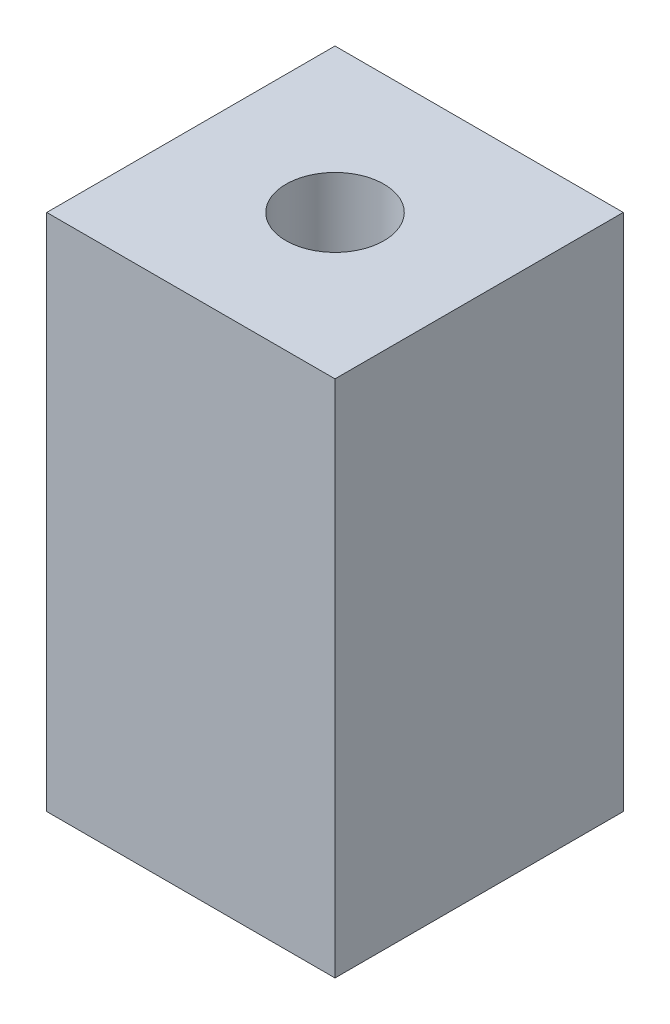
ISO-10303-21;
HEADER;
FILE_DESCRIPTION(('STEP AP214'),'2;1');
FILE_NAME('part.step','',(''),(''),'','','');
FILE_SCHEMA(('AUTOMOTIVE_DESIGN { 1 0 10303 214 1 1 1 1 }'));
ENDSEC;
DATA;
#1=APPLICATION_CONTEXT('core data for automotive mechanical design processes');
#2=APPLICATION_PROTOCOL_DEFINITION('international standard','automotive_design',2000,#1);
#3=PRODUCT_CONTEXT('',#1,'mechanical');
#4=PRODUCT('Part','Part','',(#3));
#5=PRODUCT_RELATED_PRODUCT_CATEGORY('part','',(#4));
#6=PRODUCT_DEFINITION_FORMATION('','',#4);
#7=PRODUCT_DEFINITION_CONTEXT('part definition',#1,'design');
#8=PRODUCT_DEFINITION('design','',#6,#7);
#9=PRODUCT_DEFINITION_SHAPE('','',#8);
#10=(LENGTH_UNIT() NAMED_UNIT(*) SI_UNIT(.MILLI.,.METRE.));
#11=(NAMED_UNIT(*) PLANE_ANGLE_UNIT() SI_UNIT($,.RADIAN.));
#12=(NAMED_UNIT(*) SI_UNIT($,.STERADIAN.) SOLID_ANGLE_UNIT());
#13=UNCERTAINTY_MEASURE_WITH_UNIT(LENGTH_MEASURE(1.E-05),#10,'distance_accuracy_value','');
#14=(GEOMETRIC_REPRESENTATION_CONTEXT(3) GLOBAL_UNCERTAINTY_ASSIGNED_CONTEXT((#13)) GLOBAL_UNIT_ASSIGNED_CONTEXT((#10,
#11,#12)) REPRESENTATION_CONTEXT('',''));
#15=CARTESIAN_POINT('',(0.,0.,0.));
#16=DIRECTION('',(0.,0.,1.));
#17=DIRECTION('',(1.,0.,0.));
#18=AXIS2_PLACEMENT_3D('',#15,#16,#17);
#19=CARTESIAN_POINT('',(0.,27.,0.));
#20=DIRECTION('',(0.,1.,0.));
#21=DIRECTION('',(0.,0.,1.));
#22=AXIS2_PLACEMENT_3D('',#19,#20,#21);
#23=PLANE('',#22);
#24=DIRECTION('',(0.,0.,1.));
#25=VECTOR('',#24,1.);
#26=CARTESIAN_POINT('',(-7.5,27.,-7.5));
#27=LINE('',#26,#25);
#28=CARTESIAN_POINT('',(-7.5,27.,-7.5));
#29=VERTEX_POINT('',#28);
#30=CARTESIAN_POINT('',(-7.5,27.,7.5));
#31=VERTEX_POINT('',#30);
#32=EDGE_CURVE('E94',#29,#31,#27,.T.);
#33=ORIENTED_EDGE('',*,*,#32,.T.);
#34=DIRECTION('',(1.,0.,0.));
#35=VECTOR('',#34,1.);
#36=CARTESIAN_POINT('',(-7.5,27.,7.5));
#37=LINE('',#36,#35);
#38=CARTESIAN_POINT('',(7.5,27.,7.5));
#39=VERTEX_POINT('',#38);
#40=EDGE_CURVE('E89',#31,#39,#37,.T.);
#41=ORIENTED_EDGE('',*,*,#40,.T.);
#42=DIRECTION('',(0.,0.,-1.));
#43=VECTOR('',#42,1.);
#44=CARTESIAN_POINT('',(7.5,27.,-7.5));
#45=LINE('',#44,#43);
#46=CARTESIAN_POINT('',(7.5,27.,-7.5));
#47=VERTEX_POINT('',#46);
#48=EDGE_CURVE('E92',#39,#47,#45,.T.);
#49=ORIENTED_EDGE('',*,*,#48,.T.);
#50=DIRECTION('',(-1.,0.,0.));
#51=VECTOR('',#50,1.);
#52=CARTESIAN_POINT('',(-7.5,27.,-7.5));
#53=LINE('',#52,#51);
#54=EDGE_CURVE('E59',#47,#29,#53,.T.);
#55=ORIENTED_EDGE('',*,*,#54,.T.);
#56=EDGE_LOOP('',(#33,#41,#49,#55));
#57=FACE_BOUND('',#56,.T.);
#58=CARTESIAN_POINT('',(0.,27.,0.));
#59=DIRECTION('',(0.,1.,0.));
#60=DIRECTION('',(0.,0.,1.));
#61=AXIS2_PLACEMENT_3D('',#58,#59,#60);
#62=CIRCLE('',#61,2.55);
#63=CARTESIAN_POINT('',(0.,27.,2.55));
#64=VERTEX_POINT('',#63);
#65=EDGE_CURVE('E114',#64,#64,#62,.T.);
#66=ORIENTED_EDGE('',*,*,#65,.F.);
#67=EDGE_LOOP('',(#66));
#68=FACE_BOUND('',#67,.T.);
#69=ADVANCED_FACE('F41',(#57,#68),#23,.T.);
#70=CARTESIAN_POINT('',(0.,0.,0.));
#71=DIRECTION('',(0.,1.,0.));
#72=DIRECTION('',(0.,0.,1.));
#73=AXIS2_PLACEMENT_3D('',#70,#71,#72);
#74=PLANE('',#73);
#75=DIRECTION('',(0.,0.,1.));
#76=VECTOR('',#75,1.);
#77=CARTESIAN_POINT('',(-7.5,0.,-7.5));
#78=LINE('',#77,#76);
#79=CARTESIAN_POINT('',(-7.5,0.,-7.5));
#80=VERTEX_POINT('',#79);
#81=CARTESIAN_POINT('',(-7.5,0.,7.5));
#82=VERTEX_POINT('',#81);
#83=EDGE_CURVE('E110',#80,#82,#78,.T.);
#84=ORIENTED_EDGE('',*,*,#83,.F.);
#85=DIRECTION('',(-1.,0.,0.));
#86=VECTOR('',#85,1.);
#87=CARTESIAN_POINT('',(-7.5,0.,-7.5));
#88=LINE('',#87,#86);
#89=CARTESIAN_POINT('',(7.5,0.,-7.5));
#90=VERTEX_POINT('',#89);
#91=EDGE_CURVE('E82',#90,#80,#88,.T.);
#92=ORIENTED_EDGE('',*,*,#91,.F.);
#93=DIRECTION('',(0.,0.,-1.));
#94=VECTOR('',#93,1.);
#95=CARTESIAN_POINT('',(7.5,0.,-7.5));
#96=LINE('',#95,#94);
#97=CARTESIAN_POINT('',(7.5,0.,7.5));
#98=VERTEX_POINT('',#97);
#99=EDGE_CURVE('E76',#98,#90,#96,.T.);
#100=ORIENTED_EDGE('',*,*,#99,.F.);
#101=DIRECTION('',(1.,0.,0.));
#102=VECTOR('',#101,1.);
#103=CARTESIAN_POINT('',(-7.5,0.,7.5));
#104=LINE('',#103,#102);
#105=EDGE_CURVE('E99',#82,#98,#104,.T.);
#106=ORIENTED_EDGE('',*,*,#105,.F.);
#107=EDGE_LOOP('',(#84,#92,#100,#106));
#108=FACE_BOUND('',#107,.T.);
#109=CARTESIAN_POINT('',(0.,0.,0.));
#110=DIRECTION('',(0.,1.,0.));
#111=DIRECTION('',(0.,0.,1.));
#112=AXIS2_PLACEMENT_3D('',#109,#110,#111);
#113=CIRCLE('',#112,2.55);
#114=CARTESIAN_POINT('',(0.,0.,2.55));
#115=VERTEX_POINT('',#114);
#116=EDGE_CURVE('E132',#115,#115,#113,.T.);
#117=ORIENTED_EDGE('',*,*,#116,.T.);
#118=EDGE_LOOP('',(#117));
#119=FACE_BOUND('',#118,.T.);
#120=ADVANCED_FACE('F127',(#108,#119),#74,.F.);
#121=CARTESIAN_POINT('',(-7.5,27.,-7.5));
#122=DIRECTION('',(1.,0.,0.));
#123=DIRECTION('',(0.,0.,-1.));
#124=AXIS2_PLACEMENT_3D('',#121,#122,#123);
#125=PLANE('',#124);
#126=ORIENTED_EDGE('',*,*,#83,.T.);
#127=DIRECTION('',(0.,-1.,0.));
#128=VECTOR('',#127,1.);
#129=CARTESIAN_POINT('',(-7.5,27.,7.5));
#130=LINE('',#129,#128);
#131=EDGE_CURVE('E11',#31,#82,#130,.T.);
#132=ORIENTED_EDGE('',*,*,#131,.F.);
#133=ORIENTED_EDGE('',*,*,#32,.F.);
#134=DIRECTION('',(0.,-1.,0.));
#135=VECTOR('',#134,1.);
#136=CARTESIAN_POINT('',(-7.5,27.,-7.5));
#137=LINE('',#136,#135);
#138=EDGE_CURVE('E106',#29,#80,#137,.T.);
#139=ORIENTED_EDGE('',*,*,#138,.T.);
#140=EDGE_LOOP('',(#126,#132,#133,#139));
#141=FACE_BOUND('',#140,.T.);
#142=ADVANCED_FACE('F43',(#141),#125,.F.);
#143=CARTESIAN_POINT('',(-7.5,27.,7.5));
#144=DIRECTION('',(0.,0.,-1.));
#145=DIRECTION('',(-1.,0.,0.));
#146=AXIS2_PLACEMENT_3D('',#143,#144,#145);
#147=PLANE('',#146);
#148=ORIENTED_EDGE('',*,*,#105,.T.);
#149=DIRECTION('',(0.,-1.,0.));
#150=VECTOR('',#149,1.);
#151=CARTESIAN_POINT('',(7.5,27.,7.5));
#152=LINE('',#151,#150);
#153=EDGE_CURVE('E51',#39,#98,#152,.T.);
#154=ORIENTED_EDGE('',*,*,#153,.F.);
#155=ORIENTED_EDGE('',*,*,#40,.F.);
#156=ORIENTED_EDGE('',*,*,#131,.T.);
#157=EDGE_LOOP('',(#148,#154,#155,#156));
#158=FACE_BOUND('',#157,.T.);
#159=ADVANCED_FACE('F98',(#158),#147,.F.);
#160=CARTESIAN_POINT('',(7.5,27.,-7.5));
#161=DIRECTION('',(-1.,0.,0.));
#162=DIRECTION('',(0.,0.,1.));
#163=AXIS2_PLACEMENT_3D('',#160,#161,#162);
#164=PLANE('',#163);
#165=ORIENTED_EDGE('',*,*,#99,.T.);
#166=DIRECTION('',(0.,-1.,0.));
#167=VECTOR('',#166,1.);
#168=CARTESIAN_POINT('',(7.5,27.,-7.5));
#169=LINE('',#168,#167);
#170=EDGE_CURVE('E101',#47,#90,#169,.T.);
#171=ORIENTED_EDGE('',*,*,#170,.F.);
#172=ORIENTED_EDGE('',*,*,#48,.F.);
#173=ORIENTED_EDGE('',*,*,#153,.T.);
#174=EDGE_LOOP('',(#165,#171,#172,#173));
#175=FACE_BOUND('',#174,.T.);
#176=ADVANCED_FACE('F102',(#175),#164,.F.);
#177=CARTESIAN_POINT('',(-7.5,27.,-7.5));
#178=DIRECTION('',(0.,0.,1.));
#179=DIRECTION('',(1.,0.,0.));
#180=AXIS2_PLACEMENT_3D('',#177,#178,#179);
#181=PLANE('',#180);
#182=ORIENTED_EDGE('',*,*,#91,.T.);
#183=ORIENTED_EDGE('',*,*,#138,.F.);
#184=ORIENTED_EDGE('',*,*,#54,.F.);
#185=ORIENTED_EDGE('',*,*,#170,.T.);
#186=EDGE_LOOP('',(#182,#183,#184,#185));
#187=FACE_BOUND('',#186,.T.);
#188=ADVANCED_FACE('F124',(#187),#181,.F.);
#189=CARTESIAN_POINT('',(0.,27.,0.));
#190=DIRECTION('',(0.,-1.,0.));
#191=DIRECTION('',(0.,0.,-1.));
#192=AXIS2_PLACEMENT_3D('',#189,#190,#191);
#193=CYLINDRICAL_SURFACE('',#192,2.55);
#194=ORIENTED_EDGE('',*,*,#65,.T.);
#195=EDGE_LOOP('',(#194));
#196=FACE_BOUND('',#195,.T.);
#197=ORIENTED_EDGE('',*,*,#116,.F.);
#198=EDGE_LOOP('',(#197));
#199=FACE_BOUND('',#198,.T.);
#200=ADVANCED_FACE('F140',(#196,#199),#193,.F.);
#201=CLOSED_SHELL('',(#69,#120,#142,#159,#176,#188,#200));
#202=MANIFOLD_SOLID_BREP('B2',#201);
#203=ADVANCED_BREP_SHAPE_REPRESENTATION('',(#18,#202),#14);
#204=SHAPE_DEFINITION_REPRESENTATION(#9,#203);
ENDSEC;
END-ISO-10303-21;
